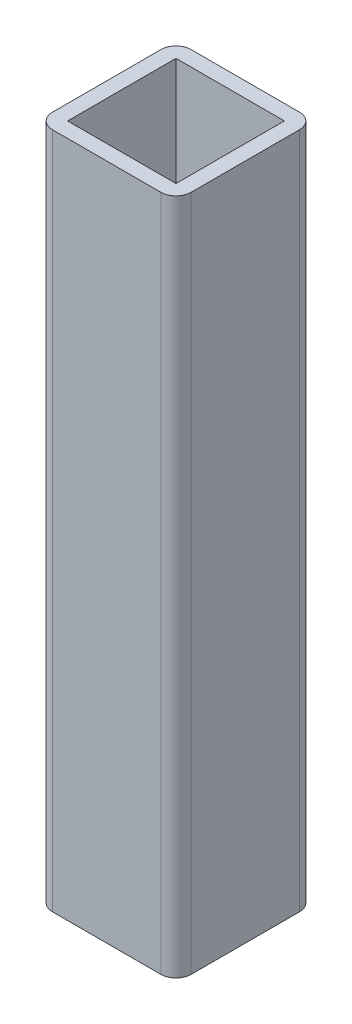
ISO-10303-21;
HEADER;
FILE_DESCRIPTION(('STEP AP214'),'2;1');
FILE_NAME('part.step','',(''),(''),'','','');
FILE_SCHEMA(('AUTOMOTIVE_DESIGN { 1 0 10303 214 1 1 1 1 }'));
ENDSEC;
DATA;
#1=APPLICATION_CONTEXT('core data for automotive mechanical design processes');
#2=APPLICATION_PROTOCOL_DEFINITION('international standard','automotive_design',2000,#1);
#3=PRODUCT_CONTEXT('',#1,'mechanical');
#4=PRODUCT('Part','Part','',(#3));
#5=PRODUCT_RELATED_PRODUCT_CATEGORY('part','',(#4));
#6=PRODUCT_DEFINITION_FORMATION('','',#4);
#7=PRODUCT_DEFINITION_CONTEXT('part definition',#1,'design');
#8=PRODUCT_DEFINITION('design','',#6,#7);
#9=PRODUCT_DEFINITION_SHAPE('','',#8);
#10=(LENGTH_UNIT() NAMED_UNIT(*) SI_UNIT(.MILLI.,.METRE.));
#11=(NAMED_UNIT(*) PLANE_ANGLE_UNIT() SI_UNIT($,.RADIAN.));
#12=(NAMED_UNIT(*) SI_UNIT($,.STERADIAN.) SOLID_ANGLE_UNIT());
#13=UNCERTAINTY_MEASURE_WITH_UNIT(LENGTH_MEASURE(1.E-05),#10,'distance_accuracy_value','');
#14=(GEOMETRIC_REPRESENTATION_CONTEXT(3) GLOBAL_UNCERTAINTY_ASSIGNED_CONTEXT((#13)) GLOBAL_UNIT_ASSIGNED_CONTEXT((#10,
#11,#12)) REPRESENTATION_CONTEXT('',''));
#15=CARTESIAN_POINT('',(0.,0.,0.));
#16=DIRECTION('',(0.,0.,1.));
#17=DIRECTION('',(1.,0.,0.));
#18=AXIS2_PLACEMENT_3D('',#15,#16,#17);
#19=CARTESIAN_POINT('',(22.8,-60.,2.8));
#20=DIRECTION('',(0.,1.,0.));
#21=DIRECTION('',(0.,0.,1.));
#22=AXIS2_PLACEMENT_3D('',#19,#20,#21);
#23=CYLINDRICAL_SURFACE('',#22,2.8);
#24=DIRECTION('',(0.,1.,0.));
#25=VECTOR('',#24,1.);
#26=CARTESIAN_POINT('',(22.8,-60.,0.));
#27=LINE('',#26,#25);
#28=CARTESIAN_POINT('',(22.8,-60.,0.));
#29=VERTEX_POINT('',#28);
#30=CARTESIAN_POINT('',(22.8,65.,0.));
#31=VERTEX_POINT('',#30);
#32=EDGE_CURVE('E197',#29,#31,#27,.T.);
#33=ORIENTED_EDGE('',*,*,#32,.T.);
#34=CARTESIAN_POINT('',(22.8,65.,2.8));
#35=DIRECTION('',(0.,1.,0.));
#36=DIRECTION('',(0.,0.,-1.));
#37=AXIS2_PLACEMENT_3D('',#34,#35,#36);
#38=CIRCLE('',#37,2.8);
#39=CARTESIAN_POINT('',(25.6,65.,2.80000000000002));
#40=VERTEX_POINT('',#39);
#41=EDGE_CURVE('E147',#40,#31,#38,.T.);
#42=ORIENTED_EDGE('',*,*,#41,.F.);
#43=DIRECTION('',(0.,1.,0.));
#44=VECTOR('',#43,1.);
#45=CARTESIAN_POINT('',(25.6,-60.,2.80000000000002));
#46=LINE('',#45,#44);
#47=CARTESIAN_POINT('',(25.6,-60.,2.80000000000002));
#48=VERTEX_POINT('',#47);
#49=EDGE_CURVE('E198',#48,#40,#46,.T.);
#50=ORIENTED_EDGE('',*,*,#49,.F.);
#51=CARTESIAN_POINT('',(22.8,-60.,2.8));
#52=DIRECTION('',(0.,1.,0.));
#53=DIRECTION('',(0.,0.,-1.));
#54=AXIS2_PLACEMENT_3D('',#51,#52,#53);
#55=CIRCLE('',#54,2.8);
#56=EDGE_CURVE('E173',#48,#29,#55,.T.);
#57=ORIENTED_EDGE('',*,*,#56,.T.);
#58=EDGE_LOOP('',(#33,#42,#50,#57));
#59=FACE_BOUND('',#58,.T.);
#60=ADVANCED_FACE('F33',(#59),#23,.T.);
#61=CARTESIAN_POINT('',(25.6,-60.,2.80000000000002));
#62=DIRECTION('',(1.,0.,0.));
#63=DIRECTION('',(0.,0.,-1.));
#64=AXIS2_PLACEMENT_3D('',#61,#62,#63);
#65=PLANE('',#64);
#66=ORIENTED_EDGE('',*,*,#49,.T.);
#67=DIRECTION('',(0.,0.,-1.));
#68=VECTOR('',#67,1.);
#69=CARTESIAN_POINT('',(25.6,65.,2.80000000000002));
#70=LINE('',#69,#68);
#71=CARTESIAN_POINT('',(25.6,65.,22.8));
#72=VERTEX_POINT('',#71);
#73=EDGE_CURVE('E170',#72,#40,#70,.T.);
#74=ORIENTED_EDGE('',*,*,#73,.F.);
#75=DIRECTION('',(0.,1.,0.));
#76=VECTOR('',#75,1.);
#77=CARTESIAN_POINT('',(25.6,-60.,22.8));
#78=LINE('',#77,#76);
#79=CARTESIAN_POINT('',(25.6,-60.,22.8));
#80=VERTEX_POINT('',#79);
#81=EDGE_CURVE('E201',#80,#72,#78,.T.);
#82=ORIENTED_EDGE('',*,*,#81,.F.);
#83=DIRECTION('',(0.,0.,-1.));
#84=VECTOR('',#83,1.);
#85=CARTESIAN_POINT('',(25.6,-60.,2.80000000000002));
#86=LINE('',#85,#84);
#87=EDGE_CURVE('E194',#80,#48,#86,.T.);
#88=ORIENTED_EDGE('',*,*,#87,.T.);
#89=EDGE_LOOP('',(#66,#74,#82,#88));
#90=FACE_BOUND('',#89,.T.);
#91=ADVANCED_FACE('F233',(#90),#65,.T.);
#92=CARTESIAN_POINT('',(22.8,-60.,22.8));
#93=DIRECTION('',(0.,1.,0.));
#94=DIRECTION('',(0.,0.,1.));
#95=AXIS2_PLACEMENT_3D('',#92,#93,#94);
#96=CYLINDRICAL_SURFACE('',#95,2.8);
#97=ORIENTED_EDGE('',*,*,#81,.T.);
#98=CARTESIAN_POINT('',(22.8,65.,22.8));
#99=DIRECTION('',(0.,1.,0.));
#100=DIRECTION('',(0.,0.,1.));
#101=AXIS2_PLACEMENT_3D('',#98,#99,#100);
#102=CIRCLE('',#101,2.8);
#103=CARTESIAN_POINT('',(22.8,65.,25.6));
#104=VERTEX_POINT('',#103);
#105=EDGE_CURVE('E167',#104,#72,#102,.T.);
#106=ORIENTED_EDGE('',*,*,#105,.F.);
#107=DIRECTION('',(0.,1.,0.));
#108=VECTOR('',#107,1.);
#109=CARTESIAN_POINT('',(22.8,-60.,25.6));
#110=LINE('',#109,#108);
#111=CARTESIAN_POINT('',(22.8,-60.,25.6));
#112=VERTEX_POINT('',#111);
#113=EDGE_CURVE('E203',#112,#104,#110,.T.);
#114=ORIENTED_EDGE('',*,*,#113,.F.);
#115=CARTESIAN_POINT('',(22.8,-60.,22.8));
#116=DIRECTION('',(0.,1.,0.));
#117=DIRECTION('',(0.,0.,1.));
#118=AXIS2_PLACEMENT_3D('',#115,#116,#117);
#119=CIRCLE('',#118,2.8);
#120=EDGE_CURVE('E191',#112,#80,#119,.T.);
#121=ORIENTED_EDGE('',*,*,#120,.T.);
#122=EDGE_LOOP('',(#97,#106,#114,#121));
#123=FACE_BOUND('',#122,.T.);
#124=ADVANCED_FACE('F238',(#123),#96,.T.);
#125=CARTESIAN_POINT('',(2.80000000000002,-60.,25.6));
#126=DIRECTION('',(0.,0.,1.));
#127=DIRECTION('',(1.,0.,0.));
#128=AXIS2_PLACEMENT_3D('',#125,#126,#127);
#129=PLANE('',#128);
#130=ORIENTED_EDGE('',*,*,#113,.T.);
#131=DIRECTION('',(1.,0.,0.));
#132=VECTOR('',#131,1.);
#133=CARTESIAN_POINT('',(2.80000000000002,65.,25.6));
#134=LINE('',#133,#132);
#135=CARTESIAN_POINT('',(2.80000000000002,65.,25.6));
#136=VERTEX_POINT('',#135);
#137=EDGE_CURVE('E164',#136,#104,#134,.T.);
#138=ORIENTED_EDGE('',*,*,#137,.F.);
#139=DIRECTION('',(0.,1.,0.));
#140=VECTOR('',#139,1.);
#141=CARTESIAN_POINT('',(2.80000000000002,-60.,25.6));
#142=LINE('',#141,#140);
#143=CARTESIAN_POINT('',(2.80000000000002,-60.,25.6));
#144=VERTEX_POINT('',#143);
#145=EDGE_CURVE('E205',#144,#136,#142,.T.);
#146=ORIENTED_EDGE('',*,*,#145,.F.);
#147=DIRECTION('',(1.,0.,0.));
#148=VECTOR('',#147,1.);
#149=CARTESIAN_POINT('',(2.80000000000002,-60.,25.6));
#150=LINE('',#149,#148);
#151=EDGE_CURVE('E188',#144,#112,#150,.T.);
#152=ORIENTED_EDGE('',*,*,#151,.T.);
#153=EDGE_LOOP('',(#130,#138,#146,#152));
#154=FACE_BOUND('',#153,.T.);
#155=ADVANCED_FACE('F265',(#154),#129,.T.);
#156=CARTESIAN_POINT('',(2.8,-60.,22.8));
#157=DIRECTION('',(0.,1.,0.));
#158=DIRECTION('',(0.,0.,1.));
#159=AXIS2_PLACEMENT_3D('',#156,#157,#158);
#160=CYLINDRICAL_SURFACE('',#159,2.8);
#161=ORIENTED_EDGE('',*,*,#145,.T.);
#162=CARTESIAN_POINT('',(2.8,65.,22.8));
#163=DIRECTION('',(0.,1.,0.));
#164=DIRECTION('',(0.,0.,1.));
#165=AXIS2_PLACEMENT_3D('',#162,#163,#164);
#166=CIRCLE('',#165,2.8);
#167=CARTESIAN_POINT('',(0.,65.,22.8));
#168=VERTEX_POINT('',#167);
#169=EDGE_CURVE('E161',#168,#136,#166,.T.);
#170=ORIENTED_EDGE('',*,*,#169,.F.);
#171=DIRECTION('',(0.,1.,0.));
#172=VECTOR('',#171,1.);
#173=CARTESIAN_POINT('',(0.,-60.,22.8));
#174=LINE('',#173,#172);
#175=CARTESIAN_POINT('',(0.,-60.,22.8));
#176=VERTEX_POINT('',#175);
#177=EDGE_CURVE('E207',#176,#168,#174,.T.);
#178=ORIENTED_EDGE('',*,*,#177,.F.);
#179=CARTESIAN_POINT('',(2.8,-60.,22.8));
#180=DIRECTION('',(0.,1.,0.));
#181=DIRECTION('',(0.,0.,1.));
#182=AXIS2_PLACEMENT_3D('',#179,#180,#181);
#183=CIRCLE('',#182,2.8);
#184=EDGE_CURVE('E185',#176,#144,#183,.T.);
#185=ORIENTED_EDGE('',*,*,#184,.T.);
#186=EDGE_LOOP('',(#161,#170,#178,#185));
#187=FACE_BOUND('',#186,.T.);
#188=ADVANCED_FACE('F262',(#187),#160,.T.);
#189=CARTESIAN_POINT('',(0.,-60.,2.80000000000002));
#190=DIRECTION('',(-1.,0.,0.));
#191=DIRECTION('',(0.,0.,1.));
#192=AXIS2_PLACEMENT_3D('',#189,#190,#191);
#193=PLANE('',#192);
#194=ORIENTED_EDGE('',*,*,#177,.T.);
#195=DIRECTION('',(0.,0.,1.));
#196=VECTOR('',#195,1.);
#197=CARTESIAN_POINT('',(0.,65.,2.80000000000002));
#198=LINE('',#197,#196);
#199=CARTESIAN_POINT('',(0.,65.,2.80000000000002));
#200=VERTEX_POINT('',#199);
#201=EDGE_CURVE('E158',#200,#168,#198,.T.);
#202=ORIENTED_EDGE('',*,*,#201,.F.);
#203=DIRECTION('',(0.,1.,0.));
#204=VECTOR('',#203,1.);
#205=CARTESIAN_POINT('',(0.,-60.,2.80000000000002));
#206=LINE('',#205,#204);
#207=CARTESIAN_POINT('',(0.,-60.,2.80000000000002));
#208=VERTEX_POINT('',#207);
#209=EDGE_CURVE('E209',#208,#200,#206,.T.);
#210=ORIENTED_EDGE('',*,*,#209,.F.);
#211=DIRECTION('',(0.,0.,1.));
#212=VECTOR('',#211,1.);
#213=CARTESIAN_POINT('',(0.,-60.,2.80000000000002));
#214=LINE('',#213,#212);
#215=EDGE_CURVE('E182',#208,#176,#214,.T.);
#216=ORIENTED_EDGE('',*,*,#215,.T.);
#217=EDGE_LOOP('',(#194,#202,#210,#216));
#218=FACE_BOUND('',#217,.T.);
#219=ADVANCED_FACE('F260',(#218),#193,.T.);
#220=CARTESIAN_POINT('',(2.8,-60.,2.8));
#221=DIRECTION('',(0.,1.,0.));
#222=DIRECTION('',(0.,0.,1.));
#223=AXIS2_PLACEMENT_3D('',#220,#221,#222);
#224=CYLINDRICAL_SURFACE('',#223,2.8);
#225=ORIENTED_EDGE('',*,*,#209,.T.);
#226=CARTESIAN_POINT('',(2.8,65.,2.8));
#227=DIRECTION('',(0.,1.,0.));
#228=DIRECTION('',(0.,0.,1.));
#229=AXIS2_PLACEMENT_3D('',#226,#227,#228);
#230=CIRCLE('',#229,2.8);
#231=CARTESIAN_POINT('',(2.80000000000002,65.,0.));
#232=VERTEX_POINT('',#231);
#233=EDGE_CURVE('E155',#232,#200,#230,.T.);
#234=ORIENTED_EDGE('',*,*,#233,.F.);
#235=DIRECTION('',(0.,1.,0.));
#236=VECTOR('',#235,1.);
#237=CARTESIAN_POINT('',(2.80000000000002,-60.,0.));
#238=LINE('',#237,#236);
#239=CARTESIAN_POINT('',(2.80000000000002,-60.,0.));
#240=VERTEX_POINT('',#239);
#241=EDGE_CURVE('E211',#240,#232,#238,.T.);
#242=ORIENTED_EDGE('',*,*,#241,.F.);
#243=CARTESIAN_POINT('',(2.8,-60.,2.8));
#244=DIRECTION('',(0.,1.,0.));
#245=DIRECTION('',(0.,0.,1.));
#246=AXIS2_PLACEMENT_3D('',#243,#244,#245);
#247=CIRCLE('',#246,2.8);
#248=EDGE_CURVE('E179',#240,#208,#247,.T.);
#249=ORIENTED_EDGE('',*,*,#248,.T.);
#250=EDGE_LOOP('',(#225,#234,#242,#249));
#251=FACE_BOUND('',#250,.T.);
#252=ADVANCED_FACE('F256',(#251),#224,.T.);
#253=CARTESIAN_POINT('',(2.80000000000002,-60.,0.));
#254=DIRECTION('',(0.,0.,-1.));
#255=DIRECTION('',(-1.,0.,0.));
#256=AXIS2_PLACEMENT_3D('',#253,#254,#255);
#257=PLANE('',#256);
#258=ORIENTED_EDGE('',*,*,#241,.T.);
#259=DIRECTION('',(-1.,0.,0.));
#260=VECTOR('',#259,1.);
#261=CARTESIAN_POINT('',(2.80000000000002,65.,0.));
#262=LINE('',#261,#260);
#263=EDGE_CURVE('E152',#31,#232,#262,.T.);
#264=ORIENTED_EDGE('',*,*,#263,.F.);
#265=ORIENTED_EDGE('',*,*,#32,.F.);
#266=DIRECTION('',(-1.,0.,0.));
#267=VECTOR('',#266,1.);
#268=CARTESIAN_POINT('',(2.80000000000002,-60.,0.));
#269=LINE('',#268,#267);
#270=EDGE_CURVE('E176',#29,#240,#269,.T.);
#271=ORIENTED_EDGE('',*,*,#270,.T.);
#272=EDGE_LOOP('',(#258,#264,#265,#271));
#273=FACE_BOUND('',#272,.T.);
#274=ADVANCED_FACE('F246',(#273),#257,.T.);
#275=CARTESIAN_POINT('',(22.8,-60.,2.8));
#276=DIRECTION('',(0.,-1.,0.));
#277=DIRECTION('',(0.,0.,-1.));
#278=AXIS2_PLACEMENT_3D('',#275,#276,#277);
#279=PLANE('',#278);
#280=DIRECTION('',(0.,0.,1.));
#281=VECTOR('',#280,1.);
#282=CARTESIAN_POINT('',(22.8,-60.,2.8));
#283=LINE('',#282,#281);
#284=CARTESIAN_POINT('',(22.8,-60.,2.8));
#285=VERTEX_POINT('',#284);
#286=CARTESIAN_POINT('',(22.8,-60.,22.8));
#287=VERTEX_POINT('',#286);
#288=EDGE_CURVE('E47',#285,#287,#283,.T.);
#289=ORIENTED_EDGE('',*,*,#288,.F.);
#290=DIRECTION('',(1.,0.,0.));
#291=VECTOR('',#290,1.);
#292=CARTESIAN_POINT('',(2.8,-60.,2.8));
#293=LINE('',#292,#291);
#294=CARTESIAN_POINT('',(2.8,-60.,2.8));
#295=VERTEX_POINT('',#294);
#296=EDGE_CURVE('E140',#295,#285,#293,.T.);
#297=ORIENTED_EDGE('',*,*,#296,.F.);
#298=DIRECTION('',(0.,0.,-1.));
#299=VECTOR('',#298,1.);
#300=CARTESIAN_POINT('',(2.8,-60.,2.8));
#301=LINE('',#300,#299);
#302=CARTESIAN_POINT('',(2.8,-60.,22.8));
#303=VERTEX_POINT('',#302);
#304=EDGE_CURVE('E124',#303,#295,#301,.T.);
#305=ORIENTED_EDGE('',*,*,#304,.F.);
#306=DIRECTION('',(-1.,0.,0.));
#307=VECTOR('',#306,1.);
#308=CARTESIAN_POINT('',(2.8,-60.,22.8));
#309=LINE('',#308,#307);
#310=EDGE_CURVE('E133',#287,#303,#309,.T.);
#311=ORIENTED_EDGE('',*,*,#310,.F.);
#312=EDGE_LOOP('',(#289,#297,#305,#311));
#313=FACE_BOUND('',#312,.T.);
#314=ORIENTED_EDGE('',*,*,#56,.F.);
#315=ORIENTED_EDGE('',*,*,#87,.F.);
#316=ORIENTED_EDGE('',*,*,#120,.F.);
#317=ORIENTED_EDGE('',*,*,#151,.F.);
#318=ORIENTED_EDGE('',*,*,#184,.F.);
#319=ORIENTED_EDGE('',*,*,#215,.F.);
#320=ORIENTED_EDGE('',*,*,#248,.F.);
#321=ORIENTED_EDGE('',*,*,#270,.F.);
#322=EDGE_LOOP('',(#314,#315,#316,#317,#318,#319,#320,#321));
#323=FACE_BOUND('',#322,.T.);
#324=ADVANCED_FACE('F137',(#313,#323),#279,.T.);
#325=CARTESIAN_POINT('',(22.8,65.,2.8));
#326=DIRECTION('',(0.,-1.,0.));
#327=DIRECTION('',(0.,0.,-1.));
#328=AXIS2_PLACEMENT_3D('',#325,#326,#327);
#329=PLANE('',#328);
#330=DIRECTION('',(1.,0.,0.));
#331=VECTOR('',#330,1.);
#332=CARTESIAN_POINT('',(22.8,65.,2.8));
#333=LINE('',#332,#331);
#334=CARTESIAN_POINT('',(2.8,64.9999999999999,2.8));
#335=VERTEX_POINT('',#334);
#336=CARTESIAN_POINT('',(22.8,64.9999999999999,2.8));
#337=VERTEX_POINT('',#336);
#338=EDGE_CURVE('E40',#335,#337,#333,.T.);
#339=ORIENTED_EDGE('',*,*,#338,.T.);
#340=DIRECTION('',(0.,0.,1.));
#341=VECTOR('',#340,1.);
#342=CARTESIAN_POINT('',(22.8,65.,2.8));
#343=LINE('',#342,#341);
#344=CARTESIAN_POINT('',(22.8,64.9999999999999,22.8));
#345=VERTEX_POINT('',#344);
#346=EDGE_CURVE('E11',#337,#345,#343,.T.);
#347=ORIENTED_EDGE('',*,*,#346,.T.);
#348=DIRECTION('',(-1.,0.,0.));
#349=VECTOR('',#348,1.);
#350=CARTESIAN_POINT('',(22.8,65.,22.8));
#351=LINE('',#350,#349);
#352=CARTESIAN_POINT('',(2.8,65.,22.8));
#353=VERTEX_POINT('',#352);
#354=EDGE_CURVE('E200',#345,#353,#351,.T.);
#355=ORIENTED_EDGE('',*,*,#354,.T.);
#356=DIRECTION('',(0.,0.,-1.));
#357=VECTOR('',#356,1.);
#358=CARTESIAN_POINT('',(2.8,65.,2.79999999999999));
#359=LINE('',#358,#357);
#360=EDGE_CURVE('E127',#353,#335,#359,.T.);
#361=ORIENTED_EDGE('',*,*,#360,.T.);
#362=EDGE_LOOP('',(#339,#347,#355,#361));
#363=FACE_BOUND('',#362,.T.);
#364=ORIENTED_EDGE('',*,*,#41,.T.);
#365=ORIENTED_EDGE('',*,*,#263,.T.);
#366=ORIENTED_EDGE('',*,*,#233,.T.);
#367=ORIENTED_EDGE('',*,*,#201,.T.);
#368=ORIENTED_EDGE('',*,*,#169,.T.);
#369=ORIENTED_EDGE('',*,*,#137,.T.);
#370=ORIENTED_EDGE('',*,*,#105,.T.);
#371=ORIENTED_EDGE('',*,*,#73,.T.);
#372=EDGE_LOOP('',(#364,#365,#366,#367,#368,#369,#370,#371));
#373=FACE_BOUND('',#372,.T.);
#374=ADVANCED_FACE('F217',(#363,#373),#329,.F.);
#375=CARTESIAN_POINT('',(22.8,980.5,2.8));
#376=DIRECTION('',(1.,0.,0.));
#377=DIRECTION('',(0.,0.,-1.));
#378=AXIS2_PLACEMENT_3D('',#375,#376,#377);
#379=PLANE('',#378);
#380=DIRECTION('',(0.,-1.,0.));
#381=VECTOR('',#380,1.);
#382=CARTESIAN_POINT('',(22.8,980.5,2.8));
#383=LINE('',#382,#381);
#384=EDGE_CURVE('E145',#337,#285,#383,.T.);
#385=ORIENTED_EDGE('',*,*,#384,.T.);
#386=ORIENTED_EDGE('',*,*,#288,.T.);
#387=DIRECTION('',(0.,-1.,0.));
#388=VECTOR('',#387,1.);
#389=CARTESIAN_POINT('',(22.8,980.5,22.8));
#390=LINE('',#389,#388);
#391=EDGE_CURVE('E130',#345,#287,#390,.T.);
#392=ORIENTED_EDGE('',*,*,#391,.F.);
#393=ORIENTED_EDGE('',*,*,#346,.F.);
#394=EDGE_LOOP('',(#385,#386,#392,#393));
#395=FACE_BOUND('',#394,.T.);
#396=ADVANCED_FACE('F222',(#395),#379,.F.);
#397=CARTESIAN_POINT('',(2.8,980.5,2.8));
#398=DIRECTION('',(0.,0.,-1.));
#399=DIRECTION('',(-1.,0.,0.));
#400=AXIS2_PLACEMENT_3D('',#397,#398,#399);
#401=PLANE('',#400);
#402=DIRECTION('',(0.,-1.,0.));
#403=VECTOR('',#402,1.);
#404=CARTESIAN_POINT('',(2.8,980.5,2.8));
#405=LINE('',#404,#403);
#406=EDGE_CURVE('E129',#335,#295,#405,.T.);
#407=ORIENTED_EDGE('',*,*,#406,.T.);
#408=ORIENTED_EDGE('',*,*,#296,.T.);
#409=ORIENTED_EDGE('',*,*,#384,.F.);
#410=ORIENTED_EDGE('',*,*,#338,.F.);
#411=EDGE_LOOP('',(#407,#408,#409,#410));
#412=FACE_BOUND('',#411,.T.);
#413=ADVANCED_FACE('F221',(#412),#401,.F.);
#414=CARTESIAN_POINT('',(2.8,980.5,2.8));
#415=DIRECTION('',(-1.,0.,0.));
#416=DIRECTION('',(0.,0.,1.));
#417=AXIS2_PLACEMENT_3D('',#414,#415,#416);
#418=PLANE('',#417);
#419=DIRECTION('',(0.,-1.,0.));
#420=VECTOR('',#419,1.);
#421=CARTESIAN_POINT('',(2.8,980.5,22.8));
#422=LINE('',#421,#420);
#423=EDGE_CURVE('E55',#353,#303,#422,.T.);
#424=ORIENTED_EDGE('',*,*,#423,.T.);
#425=ORIENTED_EDGE('',*,*,#304,.T.);
#426=ORIENTED_EDGE('',*,*,#406,.F.);
#427=ORIENTED_EDGE('',*,*,#360,.F.);
#428=EDGE_LOOP('',(#424,#425,#426,#427));
#429=FACE_BOUND('',#428,.T.);
#430=ADVANCED_FACE('F121',(#429),#418,.F.);
#431=CARTESIAN_POINT('',(2.8,980.5,22.8));
#432=DIRECTION('',(0.,0.,1.));
#433=DIRECTION('',(1.,0.,0.));
#434=AXIS2_PLACEMENT_3D('',#431,#432,#433);
#435=PLANE('',#434);
#436=ORIENTED_EDGE('',*,*,#391,.T.);
#437=ORIENTED_EDGE('',*,*,#310,.T.);
#438=ORIENTED_EDGE('',*,*,#423,.F.);
#439=ORIENTED_EDGE('',*,*,#354,.F.);
#440=EDGE_LOOP('',(#436,#437,#438,#439));
#441=FACE_BOUND('',#440,.T.);
#442=ADVANCED_FACE('F134',(#441),#435,.F.);
#443=CLOSED_SHELL('',(#60,#91,#124,#155,#188,#219,#252,#274,#324,#374,#396,#413,#430,#442));
#444=MANIFOLD_SOLID_BREP('B2',#443);
#445=ADVANCED_BREP_SHAPE_REPRESENTATION('',(#18,#444),#14);
#446=SHAPE_DEFINITION_REPRESENTATION(#9,#445);
ENDSEC;
END-ISO-10303-21;
